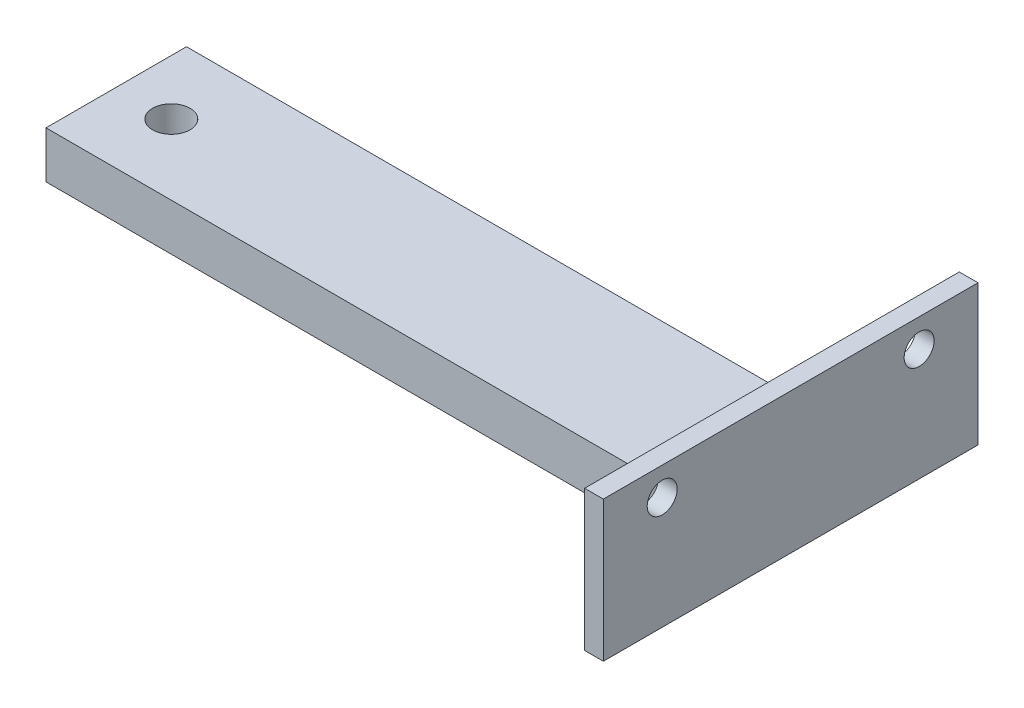
ISO-10303-21;
HEADER;
FILE_DESCRIPTION(('STEP AP214'),'2;1');
FILE_NAME('part.step','',(''),(''),'','','');
FILE_SCHEMA(('AUTOMOTIVE_DESIGN { 1 0 10303 214 1 1 1 1 }'));
ENDSEC;
DATA;
#1=APPLICATION_CONTEXT('core data for automotive mechanical design processes');
#2=APPLICATION_PROTOCOL_DEFINITION('international standard','automotive_design',2000,#1);
#3=PRODUCT_CONTEXT('',#1,'mechanical');
#4=PRODUCT('Part','Part','',(#3));
#5=PRODUCT_RELATED_PRODUCT_CATEGORY('part','',(#4));
#6=PRODUCT_DEFINITION_FORMATION('','',#4);
#7=PRODUCT_DEFINITION_CONTEXT('part definition',#1,'design');
#8=PRODUCT_DEFINITION('design','',#6,#7);
#9=PRODUCT_DEFINITION_SHAPE('','',#8);
#10=(LENGTH_UNIT() NAMED_UNIT(*) SI_UNIT(.MILLI.,.METRE.));
#11=(NAMED_UNIT(*) PLANE_ANGLE_UNIT() SI_UNIT($,.RADIAN.));
#12=(NAMED_UNIT(*) SI_UNIT($,.STERADIAN.) SOLID_ANGLE_UNIT());
#13=UNCERTAINTY_MEASURE_WITH_UNIT(LENGTH_MEASURE(1.E-05),#10,'distance_accuracy_value','');
#14=(GEOMETRIC_REPRESENTATION_CONTEXT(3) GLOBAL_UNCERTAINTY_ASSIGNED_CONTEXT((#13)) GLOBAL_UNIT_ASSIGNED_CONTEXT((#10,
#11,#12)) REPRESENTATION_CONTEXT('',''));
#15=CARTESIAN_POINT('',(0.,0.,0.));
#16=DIRECTION('',(0.,0.,1.));
#17=DIRECTION('',(1.,0.,0.));
#18=AXIS2_PLACEMENT_3D('',#15,#16,#17);
#19=CARTESIAN_POINT('',(0.,5.,15.));
#20=DIRECTION('',(1.,0.,0.));
#21=DIRECTION('',(0.,1.,0.));
#22=AXIS2_PLACEMENT_3D('',#19,#20,#21);
#23=PLANE('',#22);
#24=DIRECTION('',(0.,-1.,0.));
#25=VECTOR('',#24,1.);
#26=CARTESIAN_POINT('',(0.,5.,0.));
#27=LINE('',#26,#25);
#28=CARTESIAN_POINT('',(0.,5.,0.));
#29=VERTEX_POINT('',#28);
#30=CARTESIAN_POINT('',(0.,0.,0.));
#31=VERTEX_POINT('',#30);
#32=EDGE_CURVE('E158',#29,#31,#27,.T.);
#33=ORIENTED_EDGE('',*,*,#32,.T.);
#34=DIRECTION('',(0.,0.,-1.));
#35=VECTOR('',#34,1.);
#36=CARTESIAN_POINT('',(0.,0.,15.));
#37=LINE('',#36,#35);
#38=CARTESIAN_POINT('',(0.,0.,15.));
#39=VERTEX_POINT('',#38);
#40=EDGE_CURVE('E11',#39,#31,#37,.T.);
#41=ORIENTED_EDGE('',*,*,#40,.F.);
#42=DIRECTION('',(0.,-1.,0.));
#43=VECTOR('',#42,1.);
#44=CARTESIAN_POINT('',(0.,5.,15.));
#45=LINE('',#44,#43);
#46=CARTESIAN_POINT('',(0.,5.,15.));
#47=VERTEX_POINT('',#46);
#48=EDGE_CURVE('E161',#47,#39,#45,.T.);
#49=ORIENTED_EDGE('',*,*,#48,.F.);
#50=DIRECTION('',(0.,0.,-1.));
#51=VECTOR('',#50,1.);
#52=CARTESIAN_POINT('',(0.,5.,15.));
#53=LINE('',#52,#51);
#54=EDGE_CURVE('E167',#47,#29,#53,.T.);
#55=ORIENTED_EDGE('',*,*,#54,.T.);
#56=EDGE_LOOP('',(#33,#41,#49,#55));
#57=FACE_BOUND('',#56,.T.);
#58=ADVANCED_FACE('F39',(#57),#23,.F.);
#59=CARTESIAN_POINT('',(0.,0.,15.));
#60=DIRECTION('',(0.,1.,0.));
#61=DIRECTION('',(0.,0.,1.));
#62=AXIS2_PLACEMENT_3D('',#59,#60,#61);
#63=PLANE('',#62);
#64=CARTESIAN_POINT('',(5.87882424221288,0.,7.5));
#65=DIRECTION('',(0.,1.,0.));
#66=DIRECTION('',(0.,0.,1.));
#67=AXIS2_PLACEMENT_3D('',#64,#65,#66);
#68=CIRCLE('',#67,2.);
#69=CARTESIAN_POINT('',(5.87882424221288,0.,9.5));
#70=VERTEX_POINT('',#69);
#71=EDGE_CURVE('E155',#70,#70,#68,.T.);
#72=ORIENTED_EDGE('',*,*,#71,.T.);
#73=EDGE_LOOP('',(#72));
#74=FACE_BOUND('',#73,.T.);
#75=DIRECTION('',(1.,0.,0.));
#76=VECTOR('',#75,1.);
#77=CARTESIAN_POINT('',(0.,0.,0.));
#78=LINE('',#77,#76);
#79=CARTESIAN_POINT('',(70.,0.,0.));
#80=VERTEX_POINT('',#79);
#81=EDGE_CURVE('E170',#31,#80,#78,.T.);
#82=ORIENTED_EDGE('',*,*,#81,.T.);
#83=DIRECTION('',(0.,0.,-1.));
#84=VECTOR('',#83,1.);
#85=CARTESIAN_POINT('',(70.,0.,15.));
#86=LINE('',#85,#84);
#87=CARTESIAN_POINT('',(70.,0.,15.));
#88=VERTEX_POINT('',#87);
#89=EDGE_CURVE('E47',#88,#80,#86,.T.);
#90=ORIENTED_EDGE('',*,*,#89,.F.);
#91=DIRECTION('',(1.,0.,0.));
#92=VECTOR('',#91,1.);
#93=CARTESIAN_POINT('',(0.,0.,15.));
#94=LINE('',#93,#92);
#95=EDGE_CURVE('E79',#39,#88,#94,.T.);
#96=ORIENTED_EDGE('',*,*,#95,.F.);
#97=ORIENTED_EDGE('',*,*,#40,.T.);
#98=EDGE_LOOP('',(#82,#90,#96,#97));
#99=FACE_BOUND('',#98,.T.);
#100=ADVANCED_FACE('F183',(#74,#99),#63,.F.);
#101=CARTESIAN_POINT('',(70.,5.00000000000001,15.));
#102=DIRECTION('',(0.,-1.,0.));
#103=DIRECTION('',(1.,0.,0.));
#104=AXIS2_PLACEMENT_3D('',#101,#102,#103);
#105=PLANE('',#104);
#106=CARTESIAN_POINT('',(5.87882424221288,5.,7.5));
#107=DIRECTION('',(0.,-1.,0.));
#108=DIRECTION('',(1.,0.,0.));
#109=AXIS2_PLACEMENT_3D('',#106,#107,#108);
#110=CIRCLE('',#109,2.);
#111=CARTESIAN_POINT('',(7.87882424221288,5.,7.5));
#112=VERTEX_POINT('',#111);
#113=EDGE_CURVE('E150',#112,#112,#110,.T.);
#114=ORIENTED_EDGE('',*,*,#113,.T.);
#115=EDGE_LOOP('',(#114));
#116=FACE_BOUND('',#115,.T.);
#117=DIRECTION('',(-1.,0.,0.));
#118=VECTOR('',#117,1.);
#119=CARTESIAN_POINT('',(70.,5.00000000000001,0.));
#120=LINE('',#119,#118);
#121=CARTESIAN_POINT('',(70.,5.00000000000001,0.));
#122=VERTEX_POINT('',#121);
#123=EDGE_CURVE('E72',#122,#29,#120,.T.);
#124=ORIENTED_EDGE('',*,*,#123,.T.);
#125=ORIENTED_EDGE('',*,*,#54,.F.);
#126=DIRECTION('',(-1.,0.,0.));
#127=VECTOR('',#126,1.);
#128=CARTESIAN_POINT('',(70.,5.00000000000001,15.));
#129=LINE('',#128,#127);
#130=CARTESIAN_POINT('',(70.,5.00000000000001,15.));
#131=VERTEX_POINT('',#130);
#132=EDGE_CURVE('E55',#131,#47,#129,.T.);
#133=ORIENTED_EDGE('',*,*,#132,.F.);
#134=DIRECTION('',(0.,0.,-1.));
#135=VECTOR('',#134,1.);
#136=CARTESIAN_POINT('',(70.,5.00000000000001,15.));
#137=LINE('',#136,#135);
#138=EDGE_CURVE('E69',#131,#122,#137,.T.);
#139=ORIENTED_EDGE('',*,*,#138,.T.);
#140=EDGE_LOOP('',(#124,#125,#133,#139));
#141=FACE_BOUND('',#140,.T.);
#142=ADVANCED_FACE('F190',(#116,#141),#105,.F.);
#143=CARTESIAN_POINT('',(0.,0.,15.));
#144=DIRECTION('',(0.,0.,1.));
#145=DIRECTION('',(1.,0.,0.));
#146=AXIS2_PLACEMENT_3D('',#143,#144,#145);
#147=PLANE('',#146);
#148=ORIENTED_EDGE('',*,*,#48,.T.);
#149=ORIENTED_EDGE('',*,*,#95,.T.);
#150=DIRECTION('',(0.,1.,0.));
#151=VECTOR('',#150,1.);
#152=CARTESIAN_POINT('',(70.,0.,15.));
#153=LINE('',#152,#151);
#154=EDGE_CURVE('E164',#88,#131,#153,.T.);
#155=ORIENTED_EDGE('',*,*,#154,.T.);
#156=ORIENTED_EDGE('',*,*,#132,.T.);
#157=EDGE_LOOP('',(#148,#149,#155,#156));
#158=FACE_BOUND('',#157,.T.);
#159=ADVANCED_FACE('F192',(#158),#147,.T.);
#160=CARTESIAN_POINT('',(0.,0.,0.));
#161=DIRECTION('',(0.,0.,1.));
#162=DIRECTION('',(1.,0.,0.));
#163=AXIS2_PLACEMENT_3D('',#160,#161,#162);
#164=PLANE('',#163);
#165=ORIENTED_EDGE('',*,*,#32,.F.);
#166=ORIENTED_EDGE('',*,*,#123,.F.);
#167=DIRECTION('',(0.,1.,0.));
#168=VECTOR('',#167,1.);
#169=CARTESIAN_POINT('',(70.,0.,0.));
#170=LINE('',#169,#168);
#171=EDGE_CURVE('E173',#80,#122,#170,.T.);
#172=ORIENTED_EDGE('',*,*,#171,.F.);
#173=ORIENTED_EDGE('',*,*,#81,.F.);
#174=EDGE_LOOP('',(#165,#166,#172,#173));
#175=FACE_BOUND('',#174,.T.);
#176=ADVANCED_FACE('F187',(#175),#164,.F.);
#177=CARTESIAN_POINT('',(5.87882424221288,5.00100000000001,7.5));
#178=DIRECTION('',(0.,-1.,0.));
#179=DIRECTION('',(0.,0.,-1.));
#180=AXIS2_PLACEMENT_3D('',#177,#178,#179);
#181=CYLINDRICAL_SURFACE('',#180,2.);
#182=ORIENTED_EDGE('',*,*,#71,.F.);
#183=EDGE_LOOP('',(#182));
#184=FACE_BOUND('',#183,.T.);
#185=ORIENTED_EDGE('',*,*,#113,.F.);
#186=EDGE_LOOP('',(#185));
#187=FACE_BOUND('',#186,.T.);
#188=ADVANCED_FACE('F210',(#184,#187),#181,.F.);
#189=CARTESIAN_POINT('',(72.,12.9216916623864,27.4940828807054));
#190=DIRECTION('',(0.,1.,0.));
#191=DIRECTION('',(0.,0.,1.));
#192=AXIS2_PLACEMENT_3D('',#189,#190,#191);
#193=PLANE('',#192);
#194=DIRECTION('',(0.,0.,-1.));
#195=VECTOR('',#194,1.);
#196=CARTESIAN_POINT('',(70.,12.9216916623864,27.4940828807054));
#197=LINE('',#196,#195);
#198=CARTESIAN_POINT('',(70.,12.9216916623864,27.4940828807054));
#199=VERTEX_POINT('',#198);
#200=CARTESIAN_POINT('',(70.,12.9216916623864,-12.5059171192946));
#201=VERTEX_POINT('',#200);
#202=EDGE_CURVE('E143',#199,#201,#197,.T.);
#203=ORIENTED_EDGE('',*,*,#202,.F.);
#204=DIRECTION('',(-1.,0.,0.));
#205=VECTOR('',#204,1.);
#206=CARTESIAN_POINT('',(72.,12.9216916623864,27.4940828807054));
#207=LINE('',#206,#205);
#208=CARTESIAN_POINT('',(72.,12.9216916623864,27.4940828807054));
#209=VERTEX_POINT('',#208);
#210=EDGE_CURVE('E131',#209,#199,#207,.T.);
#211=ORIENTED_EDGE('',*,*,#210,.F.);
#212=DIRECTION('',(0.,0.,-1.));
#213=VECTOR('',#212,1.);
#214=CARTESIAN_POINT('',(72.,12.9216916623864,27.4940828807054));
#215=LINE('',#214,#213);
#216=CARTESIAN_POINT('',(72.,12.9216916623864,-12.5059171192946));
#217=VERTEX_POINT('',#216);
#218=EDGE_CURVE('E125',#209,#217,#215,.T.);
#219=ORIENTED_EDGE('',*,*,#218,.T.);
#220=DIRECTION('',(-1.,0.,0.));
#221=VECTOR('',#220,1.);
#222=CARTESIAN_POINT('',(72.,12.9216916623864,-12.5059171192946));
#223=LINE('',#222,#221);
#224=EDGE_CURVE('E109',#217,#201,#223,.T.);
#225=ORIENTED_EDGE('',*,*,#224,.T.);
#226=EDGE_LOOP('',(#203,#211,#219,#225));
#227=FACE_BOUND('',#226,.T.);
#228=ADVANCED_FACE('F130',(#227),#193,.T.);
#229=CARTESIAN_POINT('',(72.,12.9216916623864,27.4940828807054));
#230=DIRECTION('',(0.,0.,-1.));
#231=DIRECTION('',(0.,1.,0.));
#232=AXIS2_PLACEMENT_3D('',#229,#230,#231);
#233=PLANE('',#232);
#234=DIRECTION('',(0.,-1.,0.));
#235=VECTOR('',#234,1.);
#236=CARTESIAN_POINT('',(70.,12.9216916623864,27.4940828807054));
#237=LINE('',#236,#235);
#238=CARTESIAN_POINT('',(70.,-2.07830833761359,27.4940828807054));
#239=VERTEX_POINT('',#238);
#240=EDGE_CURVE('E133',#199,#239,#237,.T.);
#241=ORIENTED_EDGE('',*,*,#240,.T.);
#242=DIRECTION('',(-1.,0.,0.));
#243=VECTOR('',#242,1.);
#244=CARTESIAN_POINT('',(72.,-2.07830833761359,27.4940828807054));
#245=LINE('',#244,#243);
#246=CARTESIAN_POINT('',(72.,-2.07830833761359,27.4940828807054));
#247=VERTEX_POINT('',#246);
#248=EDGE_CURVE('E151',#247,#239,#245,.T.);
#249=ORIENTED_EDGE('',*,*,#248,.F.);
#250=DIRECTION('',(0.,-1.,0.));
#251=VECTOR('',#250,1.);
#252=CARTESIAN_POINT('',(72.,12.9216916623864,27.4940828807054));
#253=LINE('',#252,#251);
#254=EDGE_CURVE('E120',#209,#247,#253,.T.);
#255=ORIENTED_EDGE('',*,*,#254,.F.);
#256=ORIENTED_EDGE('',*,*,#210,.T.);
#257=EDGE_LOOP('',(#241,#249,#255,#256));
#258=FACE_BOUND('',#257,.T.);
#259=ADVANCED_FACE('F244',(#258),#233,.F.);
#260=CARTESIAN_POINT('',(72.,-2.07830833761359,27.4940828807054));
#261=DIRECTION('',(0.,1.,0.));
#262=DIRECTION('',(0.,0.,1.));
#263=AXIS2_PLACEMENT_3D('',#260,#261,#262);
#264=PLANE('',#263);
#265=DIRECTION('',(0.,0.,-1.));
#266=VECTOR('',#265,1.);
#267=CARTESIAN_POINT('',(70.,-2.07830833761359,27.4940828807054));
#268=LINE('',#267,#266);
#269=CARTESIAN_POINT('',(70.,-2.07830833761359,-12.5059171192946));
#270=VERTEX_POINT('',#269);
#271=EDGE_CURVE('E135',#239,#270,#268,.T.);
#272=ORIENTED_EDGE('',*,*,#271,.T.);
#273=DIRECTION('',(-1.,0.,0.));
#274=VECTOR('',#273,1.);
#275=CARTESIAN_POINT('',(72.,-2.07830833761359,-12.5059171192946));
#276=LINE('',#275,#274);
#277=CARTESIAN_POINT('',(72.,-2.07830833761359,-12.5059171192946));
#278=VERTEX_POINT('',#277);
#279=EDGE_CURVE('E119',#278,#270,#276,.T.);
#280=ORIENTED_EDGE('',*,*,#279,.F.);
#281=DIRECTION('',(0.,0.,-1.));
#282=VECTOR('',#281,1.);
#283=CARTESIAN_POINT('',(72.,-2.07830833761359,27.4940828807054));
#284=LINE('',#283,#282);
#285=EDGE_CURVE('E127',#247,#278,#284,.T.);
#286=ORIENTED_EDGE('',*,*,#285,.F.);
#287=ORIENTED_EDGE('',*,*,#248,.T.);
#288=EDGE_LOOP('',(#272,#280,#286,#287));
#289=FACE_BOUND('',#288,.T.);
#290=ADVANCED_FACE('F252',(#289),#264,.F.);
#291=CARTESIAN_POINT('',(72.,12.9216916623864,-12.5059171192946));
#292=DIRECTION('',(0.,0.,-1.));
#293=DIRECTION('',(-1.,0.,0.));
#294=AXIS2_PLACEMENT_3D('',#291,#292,#293);
#295=PLANE('',#294);
#296=DIRECTION('',(0.,-1.,0.));
#297=VECTOR('',#296,1.);
#298=CARTESIAN_POINT('',(70.,12.9216916623864,-12.5059171192946));
#299=LINE('',#298,#297);
#300=EDGE_CURVE('E114',#201,#270,#299,.T.);
#301=ORIENTED_EDGE('',*,*,#300,.F.);
#302=ORIENTED_EDGE('',*,*,#224,.F.);
#303=DIRECTION('',(0.,-1.,0.));
#304=VECTOR('',#303,1.);
#305=CARTESIAN_POINT('',(72.,12.9216916623864,-12.5059171192946));
#306=LINE('',#305,#304);
#307=EDGE_CURVE('E112',#217,#278,#306,.T.);
#308=ORIENTED_EDGE('',*,*,#307,.T.);
#309=ORIENTED_EDGE('',*,*,#279,.T.);
#310=EDGE_LOOP('',(#301,#302,#308,#309));
#311=FACE_BOUND('',#310,.T.);
#312=ADVANCED_FACE('F111',(#311),#295,.T.);
#313=CARTESIAN_POINT('',(72.,0.,0.));
#314=DIRECTION('',(-1.,0.,0.));
#315=DIRECTION('',(0.,0.,1.));
#316=AXIS2_PLACEMENT_3D('',#313,#314,#315);
#317=PLANE('',#316);
#318=CARTESIAN_POINT('',(72.,9.92331394990293,21.2100828807054));
#319=DIRECTION('',(1.,0.,0.));
#320=DIRECTION('',(0.,0.,-1.));
#321=AXIS2_PLACEMENT_3D('',#318,#319,#320);
#322=CIRCLE('',#321,1.6);
#323=CARTESIAN_POINT('',(72.,9.92331394990293,19.6100828807054));
#324=VERTEX_POINT('',#323);
#325=EDGE_CURVE('E145',#324,#324,#322,.T.);
#326=ORIENTED_EDGE('',*,*,#325,.F.);
#327=EDGE_LOOP('',(#326));
#328=FACE_BOUND('',#327,.T.);
#329=CARTESIAN_POINT('',(72.,9.92331394990293,-6.22191711929458));
#330=DIRECTION('',(1.,0.,0.));
#331=DIRECTION('',(0.,0.,-1.));
#332=AXIS2_PLACEMENT_3D('',#329,#330,#331);
#333=CIRCLE('',#332,1.6);
#334=CARTESIAN_POINT('',(72.,9.92331394990293,-7.82191711929458));
#335=VERTEX_POINT('',#334);
#336=EDGE_CURVE('E138',#335,#335,#333,.T.);
#337=ORIENTED_EDGE('',*,*,#336,.F.);
#338=EDGE_LOOP('',(#337));
#339=FACE_BOUND('',#338,.T.);
#340=ORIENTED_EDGE('',*,*,#218,.F.);
#341=ORIENTED_EDGE('',*,*,#254,.T.);
#342=ORIENTED_EDGE('',*,*,#285,.T.);
#343=ORIENTED_EDGE('',*,*,#307,.F.);
#344=EDGE_LOOP('',(#340,#341,#342,#343));
#345=FACE_BOUND('',#344,.T.);
#346=ADVANCED_FACE('F124',(#328,#339,#345),#317,.F.);
#347=CARTESIAN_POINT('',(70.,0.,0.));
#348=DIRECTION('',(-1.,0.,0.));
#349=DIRECTION('',(0.,0.,1.));
#350=AXIS2_PLACEMENT_3D('',#347,#348,#349);
#351=PLANE('',#350);
#352=CARTESIAN_POINT('',(70.,9.92331394990293,21.2100828807054));
#353=DIRECTION('',(-1.,0.,0.));
#354=DIRECTION('',(0.,0.,1.));
#355=AXIS2_PLACEMENT_3D('',#352,#353,#354);
#356=CIRCLE('',#355,1.6);
#357=CARTESIAN_POINT('',(70.,9.92331394990293,22.8100828807054));
#358=VERTEX_POINT('',#357);
#359=EDGE_CURVE('E318',#358,#358,#356,.F.);
#360=ORIENTED_EDGE('',*,*,#359,.T.);
#361=EDGE_LOOP('',(#360));
#362=FACE_BOUND('',#361,.T.);
#363=CARTESIAN_POINT('',(70.,9.92331394990293,-6.22191711929458));
#364=DIRECTION('',(-1.,0.,0.));
#365=DIRECTION('',(0.,0.,1.));
#366=AXIS2_PLACEMENT_3D('',#363,#364,#365);
#367=CIRCLE('',#366,1.6);
#368=CARTESIAN_POINT('',(70.,9.92331394990293,-4.62191711929458));
#369=VERTEX_POINT('',#368);
#370=EDGE_CURVE('E322',#369,#369,#367,.F.);
#371=ORIENTED_EDGE('',*,*,#370,.T.);
#372=EDGE_LOOP('',(#371));
#373=FACE_BOUND('',#372,.T.);
#374=ORIENTED_EDGE('',*,*,#89,.T.);
#375=ORIENTED_EDGE('',*,*,#171,.T.);
#376=ORIENTED_EDGE('',*,*,#138,.F.);
#377=ORIENTED_EDGE('',*,*,#154,.F.);
#378=EDGE_LOOP('',(#374,#375,#376,#377));
#379=FACE_BOUND('',#378,.T.);
#380=ORIENTED_EDGE('',*,*,#202,.T.);
#381=ORIENTED_EDGE('',*,*,#300,.T.);
#382=ORIENTED_EDGE('',*,*,#271,.F.);
#383=ORIENTED_EDGE('',*,*,#240,.F.);
#384=EDGE_LOOP('',(#380,#381,#382,#383));
#385=FACE_BOUND('',#384,.T.);
#386=ADVANCED_FACE('F181',(#362,#373,#379,#385),#351,.T.);
#387=CARTESIAN_POINT('',(-0.001000000000001,9.92331394990293,-6.22191711929458));
#388=DIRECTION('',(1.,0.,0.));
#389=DIRECTION('',(0.,0.,-1.));
#390=AXIS2_PLACEMENT_3D('',#387,#388,#389);
#391=CYLINDRICAL_SURFACE('',#390,1.6);
#392=ORIENTED_EDGE('',*,*,#370,.F.);
#393=EDGE_LOOP('',(#392));
#394=FACE_BOUND('',#393,.T.);
#395=ORIENTED_EDGE('',*,*,#336,.T.);
#396=EDGE_LOOP('',(#395));
#397=FACE_BOUND('',#396,.T.);
#398=ADVANCED_FACE('F284',(#394,#397),#391,.F.);
#399=CARTESIAN_POINT('',(-0.001000000000001,9.92331394990293,21.2100828807054));
#400=DIRECTION('',(1.,0.,0.));
#401=DIRECTION('',(0.,0.,-1.));
#402=AXIS2_PLACEMENT_3D('',#399,#400,#401);
#403=CYLINDRICAL_SURFACE('',#402,1.6);
#404=ORIENTED_EDGE('',*,*,#359,.F.);
#405=EDGE_LOOP('',(#404));
#406=FACE_BOUND('',#405,.T.);
#407=ORIENTED_EDGE('',*,*,#325,.T.);
#408=EDGE_LOOP('',(#407));
#409=FACE_BOUND('',#408,.T.);
#410=ADVANCED_FACE('F293',(#406,#409),#403,.F.);
#411=CLOSED_SHELL('',(#58,#100,#142,#159,#176,#188,#228,#259,#290,#312,#346,#386,#398,#410));
#412=MANIFOLD_SOLID_BREP('B2',#411);
#413=ADVANCED_BREP_SHAPE_REPRESENTATION('',(#18,#412),#14);
#414=SHAPE_DEFINITION_REPRESENTATION(#9,#413);
ENDSEC;
END-ISO-10303-21;
